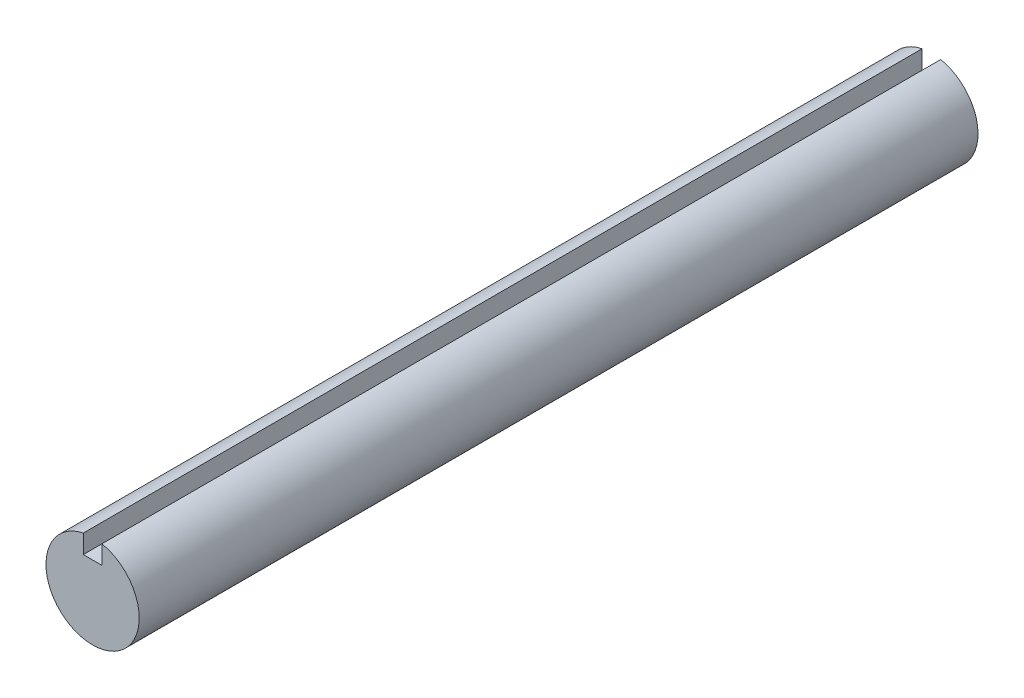
ISO-10303-21;
HEADER;
FILE_DESCRIPTION(('STEP AP214'),'2;1');
FILE_NAME('part.step','',(''),(''),'','','');
FILE_SCHEMA(('AUTOMOTIVE_DESIGN { 1 0 10303 214 1 1 1 1 }'));
ENDSEC;
DATA;
#1=APPLICATION_CONTEXT('core data for automotive mechanical design processes');
#2=APPLICATION_PROTOCOL_DEFINITION('international standard','automotive_design',2000,#1);
#3=PRODUCT_CONTEXT('',#1,'mechanical');
#4=PRODUCT('Part','Part','',(#3));
#5=PRODUCT_RELATED_PRODUCT_CATEGORY('part','',(#4));
#6=PRODUCT_DEFINITION_FORMATION('','',#4);
#7=PRODUCT_DEFINITION_CONTEXT('part definition',#1,'design');
#8=PRODUCT_DEFINITION('design','',#6,#7);
#9=PRODUCT_DEFINITION_SHAPE('','',#8);
#10=(LENGTH_UNIT() NAMED_UNIT(*) SI_UNIT(.MILLI.,.METRE.));
#11=(NAMED_UNIT(*) PLANE_ANGLE_UNIT() SI_UNIT($,.RADIAN.));
#12=(NAMED_UNIT(*) SI_UNIT($,.STERADIAN.) SOLID_ANGLE_UNIT());
#13=UNCERTAINTY_MEASURE_WITH_UNIT(LENGTH_MEASURE(1.E-05),#10,'distance_accuracy_value','');
#14=(GEOMETRIC_REPRESENTATION_CONTEXT(3) GLOBAL_UNCERTAINTY_ASSIGNED_CONTEXT((#13)) GLOBAL_UNIT_ASSIGNED_CONTEXT((#10,
#11,#12)) REPRESENTATION_CONTEXT('',''));
#15=CARTESIAN_POINT('',(0.,0.,0.));
#16=DIRECTION('',(0.,0.,1.));
#17=DIRECTION('',(1.,0.,0.));
#18=AXIS2_PLACEMENT_3D('',#15,#16,#17);
#19=CARTESIAN_POINT('',(0.,0.,28.575));
#20=DIRECTION('',(0.,0.,-1.));
#21=DIRECTION('',(-1.,0.,0.));
#22=AXIS2_PLACEMENT_3D('',#19,#20,#21);
#23=CYLINDRICAL_SURFACE('',#22,3.175);
#24=CARTESIAN_POINT('',(0.,0.,-28.575));
#25=DIRECTION('',(0.,0.,1.));
#26=DIRECTION('',(1.,0.,0.));
#27=AXIS2_PLACEMENT_3D('',#24,#25,#26);
#28=CIRCLE('',#27,3.175);
#29=CARTESIAN_POINT('',(-0.635,3.11085197333464,-28.575));
#30=VERTEX_POINT('',#29);
#31=CARTESIAN_POINT('',(0.635,3.11085197333464,-28.575));
#32=VERTEX_POINT('',#31);
#33=EDGE_CURVE('E52',#30,#32,#28,.T.);
#34=ORIENTED_EDGE('',*,*,#33,.T.);
#35=DIRECTION('',(0.,0.,1.));
#36=VECTOR('',#35,1.);
#37=CARTESIAN_POINT('',(0.635,3.11085197333464,-28.575));
#38=LINE('',#37,#36);
#39=CARTESIAN_POINT('',(0.635,3.11085197333464,28.575));
#40=VERTEX_POINT('',#39);
#41=EDGE_CURVE('E73',#32,#40,#38,.T.);
#42=ORIENTED_EDGE('',*,*,#41,.T.);
#43=CARTESIAN_POINT('',(0.,0.,28.575));
#44=DIRECTION('',(0.,0.,1.));
#45=DIRECTION('',(1.,0.,0.));
#46=AXIS2_PLACEMENT_3D('',#43,#44,#45);
#47=CIRCLE('',#46,3.175);
#48=CARTESIAN_POINT('',(-0.635,3.11085197333464,28.575));
#49=VERTEX_POINT('',#48);
#50=EDGE_CURVE('E11',#49,#40,#47,.T.);
#51=ORIENTED_EDGE('',*,*,#50,.F.);
#52=DIRECTION('',(0.,0.,1.));
#53=VECTOR('',#52,1.);
#54=CARTESIAN_POINT('',(-0.635,3.11085197333464,-28.575));
#55=LINE('',#54,#53);
#56=EDGE_CURVE('E96',#30,#49,#55,.T.);
#57=ORIENTED_EDGE('',*,*,#56,.F.);
#58=EDGE_LOOP('',(#34,#42,#51,#57));
#59=FACE_BOUND('',#58,.T.);
#60=ADVANCED_FACE('F49',(#59),#23,.T.);
#61=CARTESIAN_POINT('',(0.,0.,28.575));
#62=DIRECTION('',(0.,0.,1.));
#63=DIRECTION('',(1.,0.,0.));
#64=AXIS2_PLACEMENT_3D('',#61,#62,#63);
#65=PLANE('',#64);
#66=DIRECTION('',(0.,1.,0.));
#67=VECTOR('',#66,1.);
#68=CARTESIAN_POINT('',(0.635,1.84085197333464,28.575));
#69=LINE('',#68,#67);
#70=CARTESIAN_POINT('',(0.635,1.84085197333464,28.575));
#71=VERTEX_POINT('',#70);
#72=EDGE_CURVE('E88',#71,#40,#69,.T.);
#73=ORIENTED_EDGE('',*,*,#72,.F.);
#74=DIRECTION('',(1.,0.,0.));
#75=VECTOR('',#74,1.);
#76=CARTESIAN_POINT('',(-0.635,1.84085197333464,28.575));
#77=LINE('',#76,#75);
#78=CARTESIAN_POINT('',(-0.635,1.84085197333464,28.575));
#79=VERTEX_POINT('',#78);
#80=EDGE_CURVE('E129',#79,#71,#77,.T.);
#81=ORIENTED_EDGE('',*,*,#80,.F.);
#82=DIRECTION('',(0.,-1.,0.));
#83=VECTOR('',#82,1.);
#84=CARTESIAN_POINT('',(-0.635,3.11085197333464,28.575));
#85=LINE('',#84,#83);
#86=EDGE_CURVE('E130',#49,#79,#85,.T.);
#87=ORIENTED_EDGE('',*,*,#86,.F.);
#88=ORIENTED_EDGE('',*,*,#50,.T.);
#89=EDGE_LOOP('',(#73,#81,#87,#88));
#90=FACE_BOUND('',#89,.T.);
#91=ADVANCED_FACE('F134',(#90),#65,.T.);
#92=CARTESIAN_POINT('',(0.,0.,-28.575));
#93=DIRECTION('',(0.,0.,1.));
#94=DIRECTION('',(1.,0.,0.));
#95=AXIS2_PLACEMENT_3D('',#92,#93,#94);
#96=PLANE('',#95);
#97=DIRECTION('',(1.,0.,0.));
#98=VECTOR('',#97,1.);
#99=CARTESIAN_POINT('',(-0.635,1.84085197333464,-28.575));
#100=LINE('',#99,#98);
#101=CARTESIAN_POINT('',(-0.635,1.84085197333464,-28.575));
#102=VERTEX_POINT('',#101);
#103=CARTESIAN_POINT('',(0.635,1.84085197333464,-28.575));
#104=VERTEX_POINT('',#103);
#105=EDGE_CURVE('E64',#102,#104,#100,.T.);
#106=ORIENTED_EDGE('',*,*,#105,.T.);
#107=DIRECTION('',(0.,1.,0.));
#108=VECTOR('',#107,1.);
#109=CARTESIAN_POINT('',(0.635,1.84085197333464,-28.575));
#110=LINE('',#109,#108);
#111=EDGE_CURVE('E107',#104,#32,#110,.T.);
#112=ORIENTED_EDGE('',*,*,#111,.T.);
#113=ORIENTED_EDGE('',*,*,#33,.F.);
#114=DIRECTION('',(0.,-1.,0.));
#115=VECTOR('',#114,1.);
#116=CARTESIAN_POINT('',(-0.635,3.11085197333464,-28.575));
#117=LINE('',#116,#115);
#118=EDGE_CURVE('E92',#30,#102,#117,.T.);
#119=ORIENTED_EDGE('',*,*,#118,.T.);
#120=EDGE_LOOP('',(#106,#112,#113,#119));
#121=FACE_BOUND('',#120,.T.);
#122=ADVANCED_FACE('F109',(#121),#96,.F.);
#123=CARTESIAN_POINT('',(0.635,1.84085197333464,-28.575));
#124=DIRECTION('',(1.,0.,0.));
#125=DIRECTION('',(0.,1.,0.));
#126=AXIS2_PLACEMENT_3D('',#123,#124,#125);
#127=PLANE('',#126);
#128=ORIENTED_EDGE('',*,*,#72,.T.);
#129=ORIENTED_EDGE('',*,*,#41,.F.);
#130=ORIENTED_EDGE('',*,*,#111,.F.);
#131=DIRECTION('',(0.,0.,1.));
#132=VECTOR('',#131,1.);
#133=CARTESIAN_POINT('',(0.635,1.84085197333464,-28.575));
#134=LINE('',#133,#132);
#135=EDGE_CURVE('E114',#104,#71,#134,.T.);
#136=ORIENTED_EDGE('',*,*,#135,.T.);
#137=EDGE_LOOP('',(#128,#129,#130,#136));
#138=FACE_BOUND('',#137,.T.);
#139=ADVANCED_FACE('F165',(#138),#127,.F.);
#140=CARTESIAN_POINT('',(-0.635,1.84085197333464,-28.575));
#141=DIRECTION('',(0.,-1.,0.));
#142=DIRECTION('',(0.,0.,-1.));
#143=AXIS2_PLACEMENT_3D('',#140,#141,#142);
#144=PLANE('',#143);
#145=ORIENTED_EDGE('',*,*,#80,.T.);
#146=ORIENTED_EDGE('',*,*,#135,.F.);
#147=ORIENTED_EDGE('',*,*,#105,.F.);
#148=DIRECTION('',(0.,0.,1.));
#149=VECTOR('',#148,1.);
#150=CARTESIAN_POINT('',(-0.635,1.84085197333464,-28.575));
#151=LINE('',#150,#149);
#152=EDGE_CURVE('E98',#102,#79,#151,.T.);
#153=ORIENTED_EDGE('',*,*,#152,.T.);
#154=EDGE_LOOP('',(#145,#146,#147,#153));
#155=FACE_BOUND('',#154,.T.);
#156=ADVANCED_FACE('F127',(#155),#144,.F.);
#157=CARTESIAN_POINT('',(-0.635,3.11085197333464,-28.575));
#158=DIRECTION('',(-1.,0.,0.));
#159=DIRECTION('',(0.,-1.,0.));
#160=AXIS2_PLACEMENT_3D('',#157,#158,#159);
#161=PLANE('',#160);
#162=ORIENTED_EDGE('',*,*,#86,.T.);
#163=ORIENTED_EDGE('',*,*,#152,.F.);
#164=ORIENTED_EDGE('',*,*,#118,.F.);
#165=ORIENTED_EDGE('',*,*,#56,.T.);
#166=EDGE_LOOP('',(#162,#163,#164,#165));
#167=FACE_BOUND('',#166,.T.);
#168=ADVANCED_FACE('F95',(#167),#161,.F.);
#169=CLOSED_SHELL('',(#60,#91,#122,#139,#156,#168));
#170=MANIFOLD_SOLID_BREP('B2',#169);
#171=ADVANCED_BREP_SHAPE_REPRESENTATION('',(#18,#170),#14);
#172=SHAPE_DEFINITION_REPRESENTATION(#9,#171);
ENDSEC;
END-ISO-10303-21;
